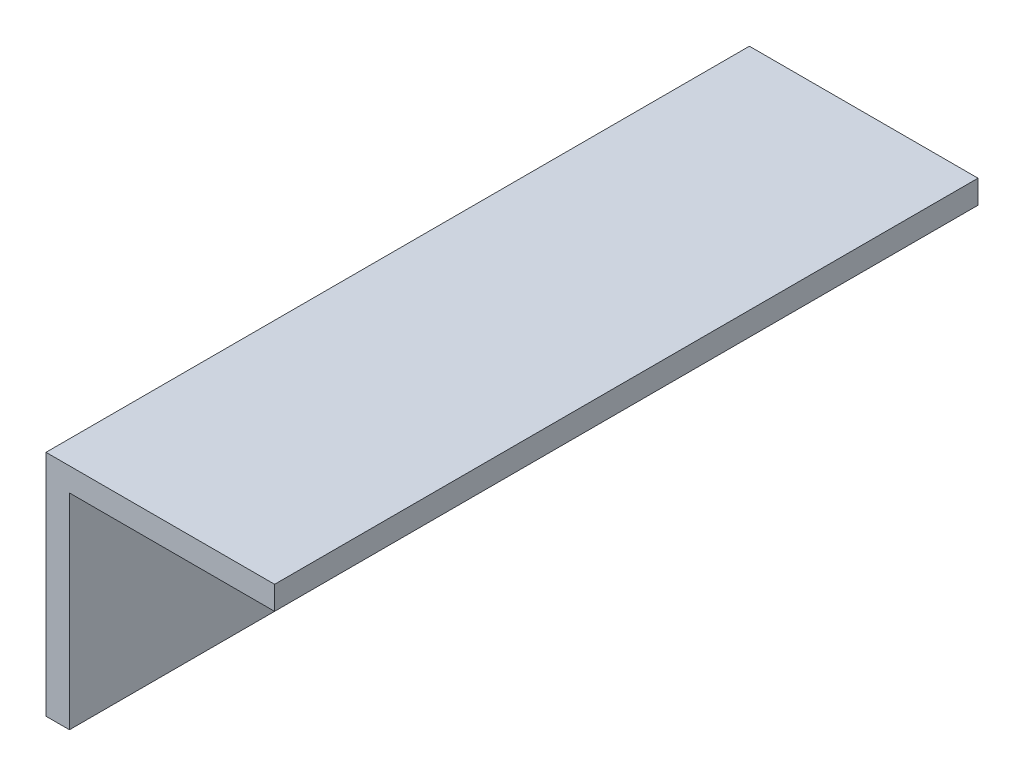
ISO-10303-21;
HEADER;
FILE_DESCRIPTION(('STEP AP214'),'2;1');
FILE_NAME('part.step','',(''),(''),'','','');
FILE_SCHEMA(('AUTOMOTIVE_DESIGN { 1 0 10303 214 1 1 1 1 }'));
ENDSEC;
DATA;
#1=APPLICATION_CONTEXT('core data for automotive mechanical design processes');
#2=APPLICATION_PROTOCOL_DEFINITION('international standard','automotive_design',2000,#1);
#3=PRODUCT_CONTEXT('',#1,'mechanical');
#4=PRODUCT('Part','Part','',(#3));
#5=PRODUCT_RELATED_PRODUCT_CATEGORY('part','',(#4));
#6=PRODUCT_DEFINITION_FORMATION('','',#4);
#7=PRODUCT_DEFINITION_CONTEXT('part definition',#1,'design');
#8=PRODUCT_DEFINITION('design','',#6,#7);
#9=PRODUCT_DEFINITION_SHAPE('','',#8);
#10=(LENGTH_UNIT() NAMED_UNIT(*) SI_UNIT(.MILLI.,.METRE.));
#11=(NAMED_UNIT(*) PLANE_ANGLE_UNIT() SI_UNIT($,.RADIAN.));
#12=(NAMED_UNIT(*) SI_UNIT($,.STERADIAN.) SOLID_ANGLE_UNIT());
#13=UNCERTAINTY_MEASURE_WITH_UNIT(LENGTH_MEASURE(1.E-05),#10,'distance_accuracy_value','');
#14=(GEOMETRIC_REPRESENTATION_CONTEXT(3) GLOBAL_UNCERTAINTY_ASSIGNED_CONTEXT((#13)) GLOBAL_UNIT_ASSIGNED_CONTEXT((#10,
#11,#12)) REPRESENTATION_CONTEXT('',''));
#15=CARTESIAN_POINT('',(0.,0.,0.));
#16=DIRECTION('',(0.,0.,1.));
#17=DIRECTION('',(1.,0.,0.));
#18=AXIS2_PLACEMENT_3D('',#15,#16,#17);
#19=CARTESIAN_POINT('',(19.5,0.,60.));
#20=DIRECTION('',(0.,-1.,0.));
#21=DIRECTION('',(-1.,0.,0.));
#22=AXIS2_PLACEMENT_3D('',#19,#20,#21);
#23=PLANE('',#22);
#24=DIRECTION('',(1.,0.,0.));
#25=VECTOR('',#24,1.);
#26=CARTESIAN_POINT('',(19.5,0.,0.));
#27=LINE('',#26,#25);
#28=CARTESIAN_POINT('',(0.,0.,0.));
#29=VERTEX_POINT('',#28);
#30=CARTESIAN_POINT('',(19.5,0.,0.));
#31=VERTEX_POINT('',#30);
#32=EDGE_CURVE('E118',#29,#31,#27,.T.);
#33=ORIENTED_EDGE('',*,*,#32,.F.);
#34=DIRECTION('',(0.,0.,-1.));
#35=VECTOR('',#34,1.);
#36=CARTESIAN_POINT('',(0.,0.,60.));
#37=LINE('',#36,#35);
#38=CARTESIAN_POINT('',(0.,0.,60.));
#39=VERTEX_POINT('',#38);
#40=EDGE_CURVE('E117',#39,#29,#37,.T.);
#41=ORIENTED_EDGE('',*,*,#40,.F.);
#42=DIRECTION('',(1.,0.,0.));
#43=VECTOR('',#42,1.);
#44=CARTESIAN_POINT('',(19.5,0.,60.));
#45=LINE('',#44,#43);
#46=CARTESIAN_POINT('',(19.5,0.,60.));
#47=VERTEX_POINT('',#46);
#48=EDGE_CURVE('E131',#39,#47,#45,.T.);
#49=ORIENTED_EDGE('',*,*,#48,.T.);
#50=DIRECTION('',(0.,0.,-1.));
#51=VECTOR('',#50,1.);
#52=CARTESIAN_POINT('',(19.5,0.,60.));
#53=LINE('',#52,#51);
#54=EDGE_CURVE('E11',#47,#31,#53,.T.);
#55=ORIENTED_EDGE('',*,*,#54,.T.);
#56=EDGE_LOOP('',(#33,#41,#49,#55));
#57=FACE_BOUND('',#56,.T.);
#58=ADVANCED_FACE('F35',(#57),#23,.F.);
#59=CARTESIAN_POINT('',(19.5,-2.,60.));
#60=DIRECTION('',(-1.,0.,0.));
#61=DIRECTION('',(0.,0.,1.));
#62=AXIS2_PLACEMENT_3D('',#59,#60,#61);
#63=PLANE('',#62);
#64=DIRECTION('',(0.,-1.,0.));
#65=VECTOR('',#64,1.);
#66=CARTESIAN_POINT('',(19.5,-2.,0.));
#67=LINE('',#66,#65);
#68=CARTESIAN_POINT('',(19.5,-2.,0.));
#69=VERTEX_POINT('',#68);
#70=EDGE_CURVE('E120',#31,#69,#67,.T.);
#71=ORIENTED_EDGE('',*,*,#70,.F.);
#72=ORIENTED_EDGE('',*,*,#54,.F.);
#73=DIRECTION('',(0.,-1.,0.));
#74=VECTOR('',#73,1.);
#75=CARTESIAN_POINT('',(19.5,-2.,60.));
#76=LINE('',#75,#74);
#77=CARTESIAN_POINT('',(19.5,-2.,60.));
#78=VERTEX_POINT('',#77);
#79=EDGE_CURVE('E83',#47,#78,#76,.T.);
#80=ORIENTED_EDGE('',*,*,#79,.T.);
#81=DIRECTION('',(0.,0.,-1.));
#82=VECTOR('',#81,1.);
#83=CARTESIAN_POINT('',(19.5,-2.,60.));
#84=LINE('',#83,#82);
#85=EDGE_CURVE('E43',#78,#69,#84,.T.);
#86=ORIENTED_EDGE('',*,*,#85,.T.);
#87=EDGE_LOOP('',(#71,#72,#80,#86));
#88=FACE_BOUND('',#87,.T.);
#89=ADVANCED_FACE('F137',(#88),#63,.F.);
#90=CARTESIAN_POINT('',(2.,-2.,60.));
#91=DIRECTION('',(0.,1.,0.));
#92=DIRECTION('',(0.,0.,-1.));
#93=AXIS2_PLACEMENT_3D('',#90,#91,#92);
#94=PLANE('',#93);
#95=DIRECTION('',(-1.,0.,0.));
#96=VECTOR('',#95,1.);
#97=CARTESIAN_POINT('',(2.,-2.,0.));
#98=LINE('',#97,#96);
#99=CARTESIAN_POINT('',(2.,-2.,0.));
#100=VERTEX_POINT('',#99);
#101=EDGE_CURVE('E124',#69,#100,#98,.T.);
#102=ORIENTED_EDGE('',*,*,#101,.F.);
#103=ORIENTED_EDGE('',*,*,#85,.F.);
#104=DIRECTION('',(-1.,0.,0.));
#105=VECTOR('',#104,1.);
#106=CARTESIAN_POINT('',(2.,-2.,60.));
#107=LINE('',#106,#105);
#108=CARTESIAN_POINT('',(2.,-2.,60.));
#109=VERTEX_POINT('',#108);
#110=EDGE_CURVE('E111',#78,#109,#107,.T.);
#111=ORIENTED_EDGE('',*,*,#110,.T.);
#112=DIRECTION('',(0.,0.,-1.));
#113=VECTOR('',#112,1.);
#114=CARTESIAN_POINT('',(2.,-2.,60.));
#115=LINE('',#114,#113);
#116=EDGE_CURVE('E105',#109,#100,#115,.T.);
#117=ORIENTED_EDGE('',*,*,#116,.T.);
#118=EDGE_LOOP('',(#102,#103,#111,#117));
#119=FACE_BOUND('',#118,.T.);
#120=ADVANCED_FACE('F169',(#119),#94,.F.);
#121=CARTESIAN_POINT('',(2.,-19.5,60.));
#122=DIRECTION('',(-1.,0.,0.));
#123=DIRECTION('',(0.,1.,0.));
#124=AXIS2_PLACEMENT_3D('',#121,#122,#123);
#125=PLANE('',#124);
#126=CARTESIAN_POINT('',(2.,-12.25,4.));
#127=DIRECTION('',(-1.,0.,0.));
#128=DIRECTION('',(0.,-1.,0.));
#129=AXIS2_PLACEMENT_3D('',#126,#127,#128);
#130=CIRCLE('',#129,1.75);
#131=CARTESIAN_POINT('',(2.,-14.,4.));
#132=VERTEX_POINT('',#131);
#133=EDGE_CURVE('E146',#132,#132,#130,.T.);
#134=ORIENTED_EDGE('',*,*,#133,.T.);
#135=EDGE_LOOP('',(#134));
#136=FACE_BOUND('',#135,.T.);
#137=DIRECTION('',(0.,-1.,0.));
#138=VECTOR('',#137,1.);
#139=CARTESIAN_POINT('',(2.,-19.5,0.));
#140=LINE('',#139,#138);
#141=CARTESIAN_POINT('',(2.,-19.5,0.));
#142=VERTEX_POINT('',#141);
#143=EDGE_CURVE('E127',#100,#142,#140,.T.);
#144=ORIENTED_EDGE('',*,*,#143,.F.);
#145=ORIENTED_EDGE('',*,*,#116,.F.);
#146=DIRECTION('',(0.,-1.,0.));
#147=VECTOR('',#146,1.);
#148=CARTESIAN_POINT('',(2.,-19.5,60.));
#149=LINE('',#148,#147);
#150=CARTESIAN_POINT('',(2.,-19.5,60.));
#151=VERTEX_POINT('',#150);
#152=EDGE_CURVE('E95',#109,#151,#149,.T.);
#153=ORIENTED_EDGE('',*,*,#152,.T.);
#154=DIRECTION('',(0.,0.,-1.));
#155=VECTOR('',#154,1.);
#156=CARTESIAN_POINT('',(2.,-19.5,60.));
#157=LINE('',#156,#155);
#158=EDGE_CURVE('E100',#151,#142,#157,.T.);
#159=ORIENTED_EDGE('',*,*,#158,.T.);
#160=EDGE_LOOP('',(#144,#145,#153,#159));
#161=FACE_BOUND('',#160,.T.);
#162=ADVANCED_FACE('F108',(#136,#161),#125,.F.);
#163=CARTESIAN_POINT('',(0.,-19.5,60.));
#164=DIRECTION('',(0.,1.,0.));
#165=DIRECTION('',(0.,0.,-1.));
#166=AXIS2_PLACEMENT_3D('',#163,#164,#165);
#167=PLANE('',#166);
#168=DIRECTION('',(-1.,0.,0.));
#169=VECTOR('',#168,1.);
#170=CARTESIAN_POINT('',(0.,-19.5,0.));
#171=LINE('',#170,#169);
#172=CARTESIAN_POINT('',(0.,-19.5,0.));
#173=VERTEX_POINT('',#172);
#174=EDGE_CURVE('E102',#142,#173,#171,.T.);
#175=ORIENTED_EDGE('',*,*,#174,.F.);
#176=ORIENTED_EDGE('',*,*,#158,.F.);
#177=DIRECTION('',(-1.,0.,0.));
#178=VECTOR('',#177,1.);
#179=CARTESIAN_POINT('',(0.,-19.5,60.));
#180=LINE('',#179,#178);
#181=CARTESIAN_POINT('',(0.,-19.5,60.));
#182=VERTEX_POINT('',#181);
#183=EDGE_CURVE('E91',#151,#182,#180,.T.);
#184=ORIENTED_EDGE('',*,*,#183,.T.);
#185=DIRECTION('',(0.,0.,-1.));
#186=VECTOR('',#185,1.);
#187=CARTESIAN_POINT('',(0.,-19.5,60.));
#188=LINE('',#187,#186);
#189=EDGE_CURVE('E106',#182,#173,#188,.T.);
#190=ORIENTED_EDGE('',*,*,#189,.T.);
#191=EDGE_LOOP('',(#175,#176,#184,#190));
#192=FACE_BOUND('',#191,.T.);
#193=ADVANCED_FACE('F101',(#192),#167,.F.);
#194=CARTESIAN_POINT('',(0.,0.,60.));
#195=DIRECTION('',(1.,0.,0.));
#196=DIRECTION('',(0.,0.,-1.));
#197=AXIS2_PLACEMENT_3D('',#194,#195,#196);
#198=PLANE('',#197);
#199=CARTESIAN_POINT('',(0.,-12.25,4.));
#200=DIRECTION('',(-1.,0.,0.));
#201=DIRECTION('',(0.,-1.,0.));
#202=AXIS2_PLACEMENT_3D('',#199,#200,#201);
#203=CIRCLE('',#202,1.75);
#204=CARTESIAN_POINT('',(0.,-14.,4.));
#205=VERTEX_POINT('',#204);
#206=EDGE_CURVE('E121',#205,#205,#203,.T.);
#207=ORIENTED_EDGE('',*,*,#206,.F.);
#208=EDGE_LOOP('',(#207));
#209=FACE_BOUND('',#208,.T.);
#210=DIRECTION('',(0.,1.,0.));
#211=VECTOR('',#210,1.);
#212=CARTESIAN_POINT('',(0.,0.,0.));
#213=LINE('',#212,#211);
#214=EDGE_CURVE('E71',#173,#29,#213,.T.);
#215=ORIENTED_EDGE('',*,*,#214,.F.);
#216=ORIENTED_EDGE('',*,*,#189,.F.);
#217=DIRECTION('',(0.,1.,0.));
#218=VECTOR('',#217,1.);
#219=CARTESIAN_POINT('',(0.,0.,60.));
#220=LINE('',#219,#218);
#221=EDGE_CURVE('E51',#182,#39,#220,.T.);
#222=ORIENTED_EDGE('',*,*,#221,.T.);
#223=ORIENTED_EDGE('',*,*,#40,.T.);
#224=EDGE_LOOP('',(#215,#216,#222,#223));
#225=FACE_BOUND('',#224,.T.);
#226=ADVANCED_FACE('F155',(#209,#225),#198,.F.);
#227=CARTESIAN_POINT('',(0.,0.,60.));
#228=DIRECTION('',(0.,0.,-1.));
#229=DIRECTION('',(-1.,0.,0.));
#230=AXIS2_PLACEMENT_3D('',#227,#228,#229);
#231=PLANE('',#230);
#232=ORIENTED_EDGE('',*,*,#48,.F.);
#233=ORIENTED_EDGE('',*,*,#221,.F.);
#234=ORIENTED_EDGE('',*,*,#183,.F.);
#235=ORIENTED_EDGE('',*,*,#152,.F.);
#236=ORIENTED_EDGE('',*,*,#110,.F.);
#237=ORIENTED_EDGE('',*,*,#79,.F.);
#238=EDGE_LOOP('',(#232,#233,#234,#235,#236,#237));
#239=FACE_BOUND('',#238,.T.);
#240=ADVANCED_FACE('F93',(#239),#231,.F.);
#241=CARTESIAN_POINT('',(0.,0.,0.));
#242=DIRECTION('',(0.,0.,-1.));
#243=DIRECTION('',(-1.,0.,0.));
#244=AXIS2_PLACEMENT_3D('',#241,#242,#243);
#245=PLANE('',#244);
#246=ORIENTED_EDGE('',*,*,#32,.T.);
#247=ORIENTED_EDGE('',*,*,#70,.T.);
#248=ORIENTED_EDGE('',*,*,#101,.T.);
#249=ORIENTED_EDGE('',*,*,#143,.T.);
#250=ORIENTED_EDGE('',*,*,#174,.T.);
#251=ORIENTED_EDGE('',*,*,#214,.T.);
#252=EDGE_LOOP('',(#246,#247,#248,#249,#250,#251));
#253=FACE_BOUND('',#252,.T.);
#254=ADVANCED_FACE('F139',(#253),#245,.T.);
#255=CARTESIAN_POINT('',(0.,-12.25,4.));
#256=DIRECTION('',(1.,0.,0.));
#257=DIRECTION('',(0.,-1.,0.));
#258=AXIS2_PLACEMENT_3D('',#255,#256,#257);
#259=CYLINDRICAL_SURFACE('',#258,1.75);
#260=ORIENTED_EDGE('',*,*,#206,.T.);
#261=EDGE_LOOP('',(#260));
#262=FACE_BOUND('',#261,.T.);
#263=ORIENTED_EDGE('',*,*,#133,.F.);
#264=EDGE_LOOP('',(#263));
#265=FACE_BOUND('',#264,.T.);
#266=ADVANCED_FACE('F152',(#262,#265),#259,.F.);
#267=CLOSED_SHELL('',(#58,#89,#120,#162,#193,#226,#240,#254,#266));
#268=MANIFOLD_SOLID_BREP('B2',#267);
#269=ADVANCED_BREP_SHAPE_REPRESENTATION('',(#18,#268),#14);
#270=SHAPE_DEFINITION_REPRESENTATION(#9,#269);
ENDSEC;
END-ISO-10303-21;
